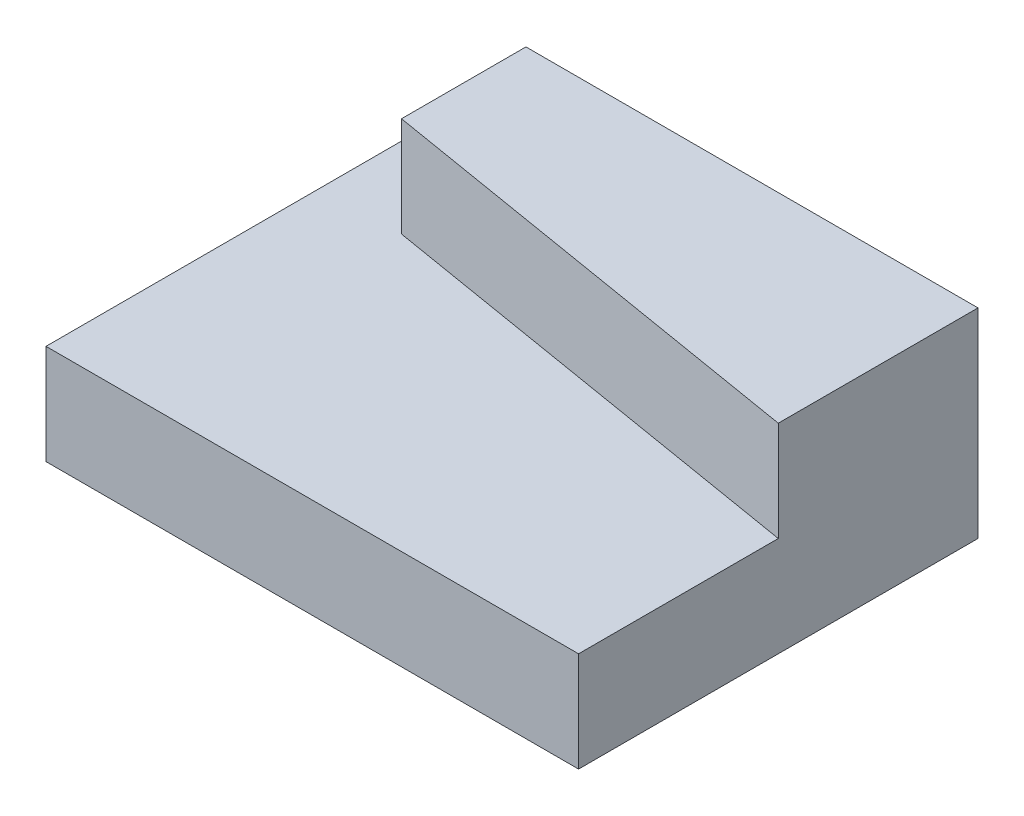
ISO-10303-21;
HEADER;
FILE_DESCRIPTION(('STEP AP214'),'2;1');
FILE_NAME('part.step','',(''),(''),'','','');
FILE_SCHEMA(('AUTOMOTIVE_DESIGN { 1 0 10303 214 1 1 1 1 }'));
ENDSEC;
DATA;
#1=APPLICATION_CONTEXT('core data for automotive mechanical design processes');
#2=APPLICATION_PROTOCOL_DEFINITION('international standard','automotive_design',2000,#1);
#3=PRODUCT_CONTEXT('',#1,'mechanical');
#4=PRODUCT('Part','Part','',(#3));
#5=PRODUCT_RELATED_PRODUCT_CATEGORY('part','',(#4));
#6=PRODUCT_DEFINITION_FORMATION('','',#4);
#7=PRODUCT_DEFINITION_CONTEXT('part definition',#1,'design');
#8=PRODUCT_DEFINITION('design','',#6,#7);
#9=PRODUCT_DEFINITION_SHAPE('','',#8);
#10=(LENGTH_UNIT() NAMED_UNIT(*) SI_UNIT(.MILLI.,.METRE.));
#11=(NAMED_UNIT(*) PLANE_ANGLE_UNIT() SI_UNIT($,.RADIAN.));
#12=(NAMED_UNIT(*) SI_UNIT($,.STERADIAN.) SOLID_ANGLE_UNIT());
#13=UNCERTAINTY_MEASURE_WITH_UNIT(LENGTH_MEASURE(1.E-05),#10,'distance_accuracy_value','');
#14=(GEOMETRIC_REPRESENTATION_CONTEXT(3) GLOBAL_UNCERTAINTY_ASSIGNED_CONTEXT((#13)) GLOBAL_UNIT_ASSIGNED_CONTEXT((#10,
#11,#12)) REPRESENTATION_CONTEXT('',''));
#15=CARTESIAN_POINT('',(0.,0.,0.));
#16=DIRECTION('',(0.,0.,1.));
#17=DIRECTION('',(1.,0.,0.));
#18=AXIS2_PLACEMENT_3D('',#15,#16,#17);
#19=CARTESIAN_POINT('',(0.,0.,-76.2));
#20=DIRECTION('',(0.,-1.,0.));
#21=DIRECTION('',(0.,0.,-1.));
#22=AXIS2_PLACEMENT_3D('',#19,#20,#21);
#23=PLANE('',#22);
#24=DIRECTION('',(0.986419885238976,0.,0.16424314294705));
#25=VECTOR('',#24,1.);
#26=CARTESIAN_POINT('',(101.6,0.,-38.1));
#27=LINE('',#26,#25);
#28=CARTESIAN_POINT('',(15.359566814368,0.,-52.4594021242706));
#29=VERTEX_POINT('',#28);
#30=CARTESIAN_POINT('',(101.6,0.,-38.1));
#31=VERTEX_POINT('',#30);
#32=EDGE_CURVE('E117',#29,#31,#27,.T.);
#33=ORIENTED_EDGE('',*,*,#32,.F.);
#34=DIRECTION('',(0.,0.,1.));
#35=VECTOR('',#34,1.);
#36=CARTESIAN_POINT('',(15.359566814368,0.,-52.4594021242706));
#37=LINE('',#36,#35);
#38=CARTESIAN_POINT('',(15.359566814368,0.,-76.2));
#39=VERTEX_POINT('',#38);
#40=EDGE_CURVE('E48',#39,#29,#37,.T.);
#41=ORIENTED_EDGE('',*,*,#40,.F.);
#42=DIRECTION('',(-1.,0.,0.));
#43=VECTOR('',#42,1.);
#44=CARTESIAN_POINT('',(0.,0.,-76.2));
#45=LINE('',#44,#43);
#46=CARTESIAN_POINT('',(0.,0.,-76.2));
#47=VERTEX_POINT('',#46);
#48=EDGE_CURVE('E143',#39,#47,#45,.T.);
#49=ORIENTED_EDGE('',*,*,#48,.T.);
#50=DIRECTION('',(0.,0.,1.));
#51=VECTOR('',#50,1.);
#52=CARTESIAN_POINT('',(0.,0.,0.));
#53=LINE('',#52,#51);
#54=CARTESIAN_POINT('',(0.,0.,0.));
#55=VERTEX_POINT('',#54);
#56=EDGE_CURVE('E134',#47,#55,#53,.T.);
#57=ORIENTED_EDGE('',*,*,#56,.T.);
#58=DIRECTION('',(1.,0.,0.));
#59=VECTOR('',#58,1.);
#60=CARTESIAN_POINT('',(0.,0.,0.));
#61=LINE('',#60,#59);
#62=CARTESIAN_POINT('',(101.6,0.,0.));
#63=VERTEX_POINT('',#62);
#64=EDGE_CURVE('E137',#55,#63,#61,.T.);
#65=ORIENTED_EDGE('',*,*,#64,.T.);
#66=DIRECTION('',(0.,0.,-1.));
#67=VECTOR('',#66,1.);
#68=CARTESIAN_POINT('',(101.6,0.,0.));
#69=LINE('',#68,#67);
#70=EDGE_CURVE('E54',#63,#31,#69,.T.);
#71=ORIENTED_EDGE('',*,*,#70,.T.);
#72=EDGE_LOOP('',(#33,#41,#49,#57,#65,#71));
#73=FACE_BOUND('',#72,.T.);
#74=ADVANCED_FACE('F31',(#73),#23,.F.);
#75=CARTESIAN_POINT('',(0.,-19.05,0.));
#76=DIRECTION('',(-1.,0.,0.));
#77=DIRECTION('',(0.,0.,1.));
#78=AXIS2_PLACEMENT_3D('',#75,#76,#77);
#79=PLANE('',#78);
#80=ORIENTED_EDGE('',*,*,#56,.F.);
#81=DIRECTION('',(0.,1.,0.));
#82=VECTOR('',#81,1.);
#83=CARTESIAN_POINT('',(0.,-19.05,-76.2));
#84=LINE('',#83,#82);
#85=CARTESIAN_POINT('',(0.,-19.05,-76.2));
#86=VERTEX_POINT('',#85);
#87=EDGE_CURVE('E11',#86,#47,#84,.T.);
#88=ORIENTED_EDGE('',*,*,#87,.F.);
#89=DIRECTION('',(0.,0.,1.));
#90=VECTOR('',#89,1.);
#91=CARTESIAN_POINT('',(0.,-19.05,0.));
#92=LINE('',#91,#90);
#93=CARTESIAN_POINT('',(0.,-19.05,0.));
#94=VERTEX_POINT('',#93);
#95=EDGE_CURVE('E146',#86,#94,#92,.T.);
#96=ORIENTED_EDGE('',*,*,#95,.T.);
#97=DIRECTION('',(0.,1.,0.));
#98=VECTOR('',#97,1.);
#99=CARTESIAN_POINT('',(0.,-19.05,0.));
#100=LINE('',#99,#98);
#101=EDGE_CURVE('E153',#94,#55,#100,.T.);
#102=ORIENTED_EDGE('',*,*,#101,.T.);
#103=EDGE_LOOP('',(#80,#88,#96,#102));
#104=FACE_BOUND('',#103,.T.);
#105=ADVANCED_FACE('F33',(#104),#79,.T.);
#106=CARTESIAN_POINT('',(0.,-19.05,-76.2));
#107=DIRECTION('',(0.,0.,-1.));
#108=DIRECTION('',(-1.,0.,0.));
#109=AXIS2_PLACEMENT_3D('',#106,#107,#108);
#110=PLANE('',#109);
#111=ORIENTED_EDGE('',*,*,#48,.F.);
#112=DIRECTION('',(0.,-1.,0.));
#113=VECTOR('',#112,1.);
#114=CARTESIAN_POINT('',(15.359566814368,19.05,-76.2));
#115=LINE('',#114,#113);
#116=CARTESIAN_POINT('',(15.359566814368,19.05,-76.2));
#117=VERTEX_POINT('',#116);
#118=EDGE_CURVE('E108',#117,#39,#115,.T.);
#119=ORIENTED_EDGE('',*,*,#118,.F.);
#120=DIRECTION('',(-1.,0.,0.));
#121=VECTOR('',#120,1.);
#122=CARTESIAN_POINT('',(101.6,19.05,-76.2));
#123=LINE('',#122,#121);
#124=CARTESIAN_POINT('',(101.6,19.05,-76.2));
#125=VERTEX_POINT('',#124);
#126=EDGE_CURVE('E105',#125,#117,#123,.T.);
#127=ORIENTED_EDGE('',*,*,#126,.F.);
#128=DIRECTION('',(0.,1.,0.));
#129=VECTOR('',#128,1.);
#130=CARTESIAN_POINT('',(101.6,-19.05,-76.2));
#131=LINE('',#130,#129);
#132=CARTESIAN_POINT('',(101.6,-19.05,-76.2));
#133=VERTEX_POINT('',#132);
#134=EDGE_CURVE('E40',#133,#125,#131,.T.);
#135=ORIENTED_EDGE('',*,*,#134,.F.);
#136=DIRECTION('',(-1.,0.,0.));
#137=VECTOR('',#136,1.);
#138=CARTESIAN_POINT('',(0.,-19.05,-76.2));
#139=LINE('',#138,#137);
#140=EDGE_CURVE('E154',#133,#86,#139,.T.);
#141=ORIENTED_EDGE('',*,*,#140,.T.);
#142=ORIENTED_EDGE('',*,*,#87,.T.);
#143=EDGE_LOOP('',(#111,#119,#127,#135,#141,#142));
#144=FACE_BOUND('',#143,.T.);
#145=ADVANCED_FACE('F106',(#144),#110,.T.);
#146=CARTESIAN_POINT('',(101.6,-19.05,0.));
#147=DIRECTION('',(1.,0.,0.));
#148=DIRECTION('',(0.,0.,-1.));
#149=AXIS2_PLACEMENT_3D('',#146,#147,#148);
#150=PLANE('',#149);
#151=ORIENTED_EDGE('',*,*,#70,.F.);
#152=DIRECTION('',(0.,1.,0.));
#153=VECTOR('',#152,1.);
#154=CARTESIAN_POINT('',(101.6,-19.05,0.));
#155=LINE('',#154,#153);
#156=CARTESIAN_POINT('',(101.6,-19.05,0.));
#157=VERTEX_POINT('',#156);
#158=EDGE_CURVE('E102',#157,#63,#155,.T.);
#159=ORIENTED_EDGE('',*,*,#158,.F.);
#160=DIRECTION('',(0.,0.,-1.));
#161=VECTOR('',#160,1.);
#162=CARTESIAN_POINT('',(101.6,-19.05,0.));
#163=LINE('',#162,#161);
#164=EDGE_CURVE('E98',#157,#133,#163,.T.);
#165=ORIENTED_EDGE('',*,*,#164,.T.);
#166=ORIENTED_EDGE('',*,*,#134,.T.);
#167=DIRECTION('',(0.,0.,-1.));
#168=VECTOR('',#167,1.);
#169=CARTESIAN_POINT('',(101.6,19.05,-76.2));
#170=LINE('',#169,#168);
#171=CARTESIAN_POINT('',(101.6,19.05,-38.1));
#172=VERTEX_POINT('',#171);
#173=EDGE_CURVE('E96',#172,#125,#170,.T.);
#174=ORIENTED_EDGE('',*,*,#173,.F.);
#175=DIRECTION('',(0.,-1.,0.));
#176=VECTOR('',#175,1.);
#177=CARTESIAN_POINT('',(101.6,19.05,-38.1));
#178=LINE('',#177,#176);
#179=EDGE_CURVE('E123',#172,#31,#178,.T.);
#180=ORIENTED_EDGE('',*,*,#179,.T.);
#181=EDGE_LOOP('',(#151,#159,#165,#166,#174,#180));
#182=FACE_BOUND('',#181,.T.);
#183=ADVANCED_FACE('F93',(#182),#150,.T.);
#184=CARTESIAN_POINT('',(0.,-19.05,0.));
#185=DIRECTION('',(0.,0.,1.));
#186=DIRECTION('',(1.,0.,0.));
#187=AXIS2_PLACEMENT_3D('',#184,#185,#186);
#188=PLANE('',#187);
#189=ORIENTED_EDGE('',*,*,#64,.F.);
#190=ORIENTED_EDGE('',*,*,#101,.F.);
#191=DIRECTION('',(1.,0.,0.));
#192=VECTOR('',#191,1.);
#193=CARTESIAN_POINT('',(0.,-19.05,0.));
#194=LINE('',#193,#192);
#195=EDGE_CURVE('E160',#94,#157,#194,.T.);
#196=ORIENTED_EDGE('',*,*,#195,.T.);
#197=ORIENTED_EDGE('',*,*,#158,.T.);
#198=EDGE_LOOP('',(#189,#190,#196,#197));
#199=FACE_BOUND('',#198,.T.);
#200=ADVANCED_FACE('F164',(#199),#188,.T.);
#201=CARTESIAN_POINT('',(0.,-19.05,-76.2));
#202=DIRECTION('',(0.,-1.,0.));
#203=DIRECTION('',(0.,0.,-1.));
#204=AXIS2_PLACEMENT_3D('',#201,#202,#203);
#205=PLANE('',#204);
#206=ORIENTED_EDGE('',*,*,#95,.F.);
#207=ORIENTED_EDGE('',*,*,#140,.F.);
#208=ORIENTED_EDGE('',*,*,#164,.F.);
#209=ORIENTED_EDGE('',*,*,#195,.F.);
#210=EDGE_LOOP('',(#206,#207,#208,#209));
#211=FACE_BOUND('',#210,.T.);
#212=ADVANCED_FACE('F169',(#211),#205,.T.);
#213=CARTESIAN_POINT('',(15.359566814368,19.05,-52.4594021242706));
#214=DIRECTION('',(1.,0.,0.));
#215=DIRECTION('',(0.,0.,-1.));
#216=AXIS2_PLACEMENT_3D('',#213,#214,#215);
#217=PLANE('',#216);
#218=ORIENTED_EDGE('',*,*,#40,.T.);
#219=DIRECTION('',(0.,-1.,0.));
#220=VECTOR('',#219,1.);
#221=CARTESIAN_POINT('',(15.359566814368,19.05,-52.4594021242706));
#222=LINE('',#221,#220);
#223=CARTESIAN_POINT('',(15.359566814368,19.05,-52.4594021242706));
#224=VERTEX_POINT('',#223);
#225=EDGE_CURVE('E126',#224,#29,#222,.T.);
#226=ORIENTED_EDGE('',*,*,#225,.F.);
#227=DIRECTION('',(0.,0.,1.));
#228=VECTOR('',#227,1.);
#229=CARTESIAN_POINT('',(15.359566814368,19.05,-52.4594021242706));
#230=LINE('',#229,#228);
#231=EDGE_CURVE('E111',#117,#224,#230,.T.);
#232=ORIENTED_EDGE('',*,*,#231,.F.);
#233=ORIENTED_EDGE('',*,*,#118,.T.);
#234=EDGE_LOOP('',(#218,#226,#232,#233));
#235=FACE_BOUND('',#234,.T.);
#236=ADVANCED_FACE('F189',(#235),#217,.F.);
#237=CARTESIAN_POINT('',(101.6,19.05,-38.1));
#238=DIRECTION('',(0.16424314294705,0.,-0.986419885238976));
#239=DIRECTION('',(-0.986419885238976,0.,-0.16424314294705));
#240=AXIS2_PLACEMENT_3D('',#237,#238,#239);
#241=PLANE('',#240);
#242=ORIENTED_EDGE('',*,*,#32,.T.);
#243=ORIENTED_EDGE('',*,*,#179,.F.);
#244=DIRECTION('',(0.986419885238976,0.,0.16424314294705));
#245=VECTOR('',#244,1.);
#246=CARTESIAN_POINT('',(101.6,19.05,-38.1));
#247=LINE('',#246,#245);
#248=EDGE_CURVE('E115',#224,#172,#247,.T.);
#249=ORIENTED_EDGE('',*,*,#248,.F.);
#250=ORIENTED_EDGE('',*,*,#225,.T.);
#251=EDGE_LOOP('',(#242,#243,#249,#250));
#252=FACE_BOUND('',#251,.T.);
#253=ADVANCED_FACE('F193',(#252),#241,.F.);
#254=CARTESIAN_POINT('',(101.6,19.05,-76.2));
#255=DIRECTION('',(0.,-1.,0.));
#256=DIRECTION('',(0.,0.,-1.));
#257=AXIS2_PLACEMENT_3D('',#254,#255,#256);
#258=PLANE('',#257);
#259=ORIENTED_EDGE('',*,*,#173,.T.);
#260=ORIENTED_EDGE('',*,*,#126,.T.);
#261=ORIENTED_EDGE('',*,*,#231,.T.);
#262=ORIENTED_EDGE('',*,*,#248,.T.);
#263=EDGE_LOOP('',(#259,#260,#261,#262));
#264=FACE_BOUND('',#263,.T.);
#265=ADVANCED_FACE('F113',(#264),#258,.F.);
#266=CLOSED_SHELL('',(#74,#105,#145,#183,#200,#212,#236,#253,#265));
#267=MANIFOLD_SOLID_BREP('B2',#266);
#268=ADVANCED_BREP_SHAPE_REPRESENTATION('',(#18,#267),#14);
#269=SHAPE_DEFINITION_REPRESENTATION(#9,#268);
ENDSEC;
END-ISO-10303-21;
